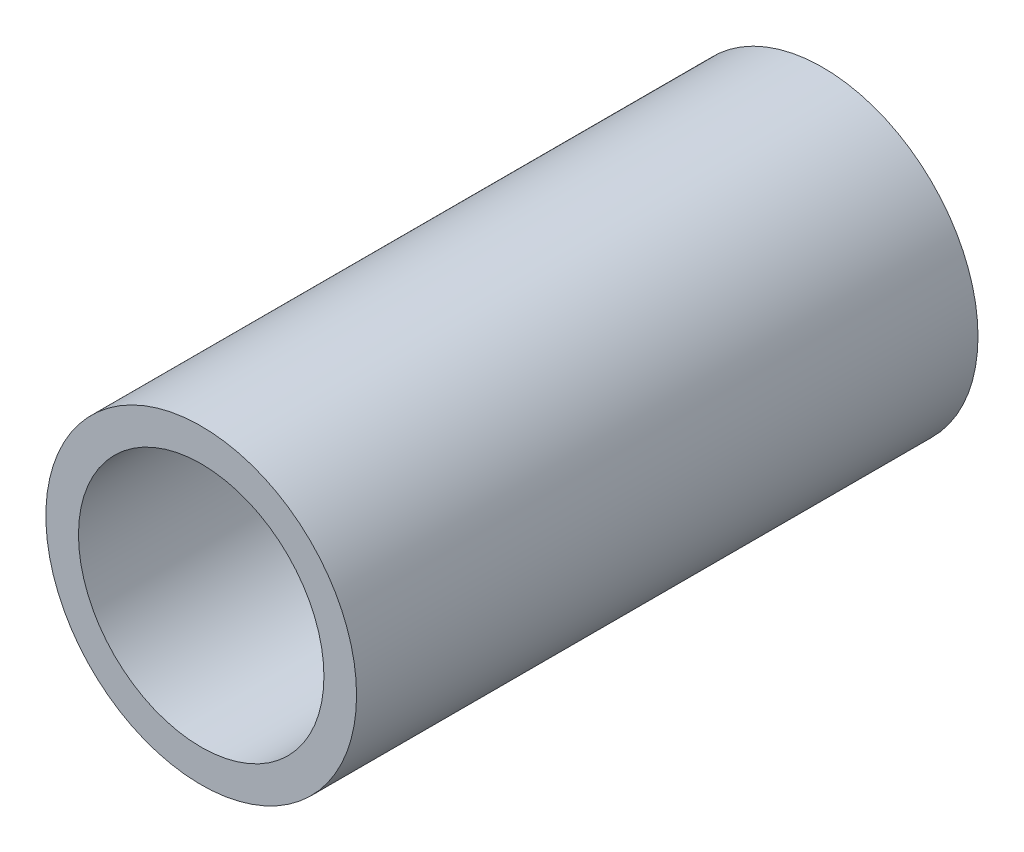
ISO-10303-21;
HEADER;
FILE_DESCRIPTION(('STEP AP214'),'2;1');
FILE_NAME('part.step','',(''),(''),'','','');
FILE_SCHEMA(('AUTOMOTIVE_DESIGN { 1 0 10303 214 1 1 1 1 }'));
ENDSEC;
DATA;
#1=APPLICATION_CONTEXT('core data for automotive mechanical design processes');
#2=APPLICATION_PROTOCOL_DEFINITION('international standard','automotive_design',2000,#1);
#3=PRODUCT_CONTEXT('',#1,'mechanical');
#4=PRODUCT('Part','Part','',(#3));
#5=PRODUCT_RELATED_PRODUCT_CATEGORY('part','',(#4));
#6=PRODUCT_DEFINITION_FORMATION('','',#4);
#7=PRODUCT_DEFINITION_CONTEXT('part definition',#1,'design');
#8=PRODUCT_DEFINITION('design','',#6,#7);
#9=PRODUCT_DEFINITION_SHAPE('','',#8);
#10=(LENGTH_UNIT() NAMED_UNIT(*) SI_UNIT(.MILLI.,.METRE.));
#11=(NAMED_UNIT(*) PLANE_ANGLE_UNIT() SI_UNIT($,.RADIAN.));
#12=(NAMED_UNIT(*) SI_UNIT($,.STERADIAN.) SOLID_ANGLE_UNIT());
#13=UNCERTAINTY_MEASURE_WITH_UNIT(LENGTH_MEASURE(1.E-05),#10,'distance_accuracy_value','');
#14=(GEOMETRIC_REPRESENTATION_CONTEXT(3) GLOBAL_UNCERTAINTY_ASSIGNED_CONTEXT((#13)) GLOBAL_UNIT_ASSIGNED_CONTEXT((#10,
#11,#12)) REPRESENTATION_CONTEXT('',''));
#15=CARTESIAN_POINT('',(0.,0.,0.));
#16=DIRECTION('',(0.,0.,1.));
#17=DIRECTION('',(1.,0.,0.));
#18=AXIS2_PLACEMENT_3D('',#15,#16,#17);
#19=CARTESIAN_POINT('',(0.,0.,50.));
#20=DIRECTION('',(0.,0.,1.));
#21=DIRECTION('',(1.,0.,0.));
#22=AXIS2_PLACEMENT_3D('',#19,#20,#21);
#23=CYLINDRICAL_SURFACE('',#22,19.75);
#24=CARTESIAN_POINT('',(0.,0.,50.));
#25=DIRECTION('',(0.,0.,1.));
#26=DIRECTION('',(1.,0.,0.));
#27=AXIS2_PLACEMENT_3D('',#24,#25,#26);
#28=CIRCLE('',#27,19.75);
#29=CARTESIAN_POINT('',(19.75,0.,50.));
#30=VERTEX_POINT('',#29);
#31=EDGE_CURVE('E36',#30,#30,#28,.F.);
#32=ORIENTED_EDGE('',*,*,#31,.T.);
#33=EDGE_LOOP('',(#32));
#34=FACE_BOUND('',#33,.T.);
#35=CARTESIAN_POINT('',(0.,0.,150.));
#36=DIRECTION('',(0.,0.,1.));
#37=DIRECTION('',(1.,0.,0.));
#38=AXIS2_PLACEMENT_3D('',#35,#36,#37);
#39=CIRCLE('',#38,19.75);
#40=CARTESIAN_POINT('',(19.75,0.,150.));
#41=VERTEX_POINT('',#40);
#42=EDGE_CURVE('E47',#41,#41,#39,.T.);
#43=ORIENTED_EDGE('',*,*,#42,.T.);
#44=EDGE_LOOP('',(#43));
#45=FACE_BOUND('',#44,.T.);
#46=ADVANCED_FACE('F33',(#34,#45),#23,.F.);
#47=CARTESIAN_POINT('',(0.,0.,50.));
#48=DIRECTION('',(0.,0.,1.));
#49=DIRECTION('',(1.,0.,0.));
#50=AXIS2_PLACEMENT_3D('',#47,#48,#49);
#51=PLANE('',#50);
#52=ORIENTED_EDGE('',*,*,#31,.F.);
#53=EDGE_LOOP('',(#52));
#54=FACE_BOUND('',#53,.T.);
#55=CARTESIAN_POINT('',(0.,0.,50.));
#56=DIRECTION('',(0.,0.,1.));
#57=DIRECTION('',(1.,0.,0.));
#58=AXIS2_PLACEMENT_3D('',#55,#56,#57);
#59=CIRCLE('',#58,25.);
#60=CARTESIAN_POINT('',(25.,0.,50.));
#61=VERTEX_POINT('',#60);
#62=EDGE_CURVE('E10',#61,#61,#59,.T.);
#63=ORIENTED_EDGE('',*,*,#62,.F.);
#64=EDGE_LOOP('',(#63));
#65=FACE_BOUND('',#64,.T.);
#66=ADVANCED_FACE('F60',(#54,#65),#51,.F.);
#67=CARTESIAN_POINT('',(0.,0.,50.));
#68=DIRECTION('',(0.,0.,1.));
#69=DIRECTION('',(1.,0.,0.));
#70=AXIS2_PLACEMENT_3D('',#67,#68,#69);
#71=CYLINDRICAL_SURFACE('',#70,25.);
#72=ORIENTED_EDGE('',*,*,#62,.T.);
#73=EDGE_LOOP('',(#72));
#74=FACE_BOUND('',#73,.T.);
#75=CARTESIAN_POINT('',(0.,0.,150.));
#76=DIRECTION('',(0.,0.,1.));
#77=DIRECTION('',(1.,0.,0.));
#78=AXIS2_PLACEMENT_3D('',#75,#76,#77);
#79=CIRCLE('',#78,25.);
#80=CARTESIAN_POINT('',(25.,0.,150.));
#81=VERTEX_POINT('',#80);
#82=EDGE_CURVE('E43',#81,#81,#79,.T.);
#83=ORIENTED_EDGE('',*,*,#82,.F.);
#84=EDGE_LOOP('',(#83));
#85=FACE_BOUND('',#84,.T.);
#86=ADVANCED_FACE('F54',(#74,#85),#71,.T.);
#87=CARTESIAN_POINT('',(0.,0.,150.));
#88=DIRECTION('',(0.,0.,1.));
#89=DIRECTION('',(1.,0.,0.));
#90=AXIS2_PLACEMENT_3D('',#87,#88,#89);
#91=PLANE('',#90);
#92=ORIENTED_EDGE('',*,*,#82,.T.);
#93=EDGE_LOOP('',(#92));
#94=FACE_BOUND('',#93,.T.);
#95=ORIENTED_EDGE('',*,*,#42,.F.);
#96=EDGE_LOOP('',(#95));
#97=FACE_BOUND('',#96,.T.);
#98=ADVANCED_FACE('F52',(#94,#97),#91,.T.);
#99=CLOSED_SHELL('',(#46,#66,#86,#98));
#100=MANIFOLD_SOLID_BREP('B2',#99);
#101=ADVANCED_BREP_SHAPE_REPRESENTATION('',(#18,#100),#14);
#102=SHAPE_DEFINITION_REPRESENTATION(#9,#101);
ENDSEC;
END-ISO-10303-21;
